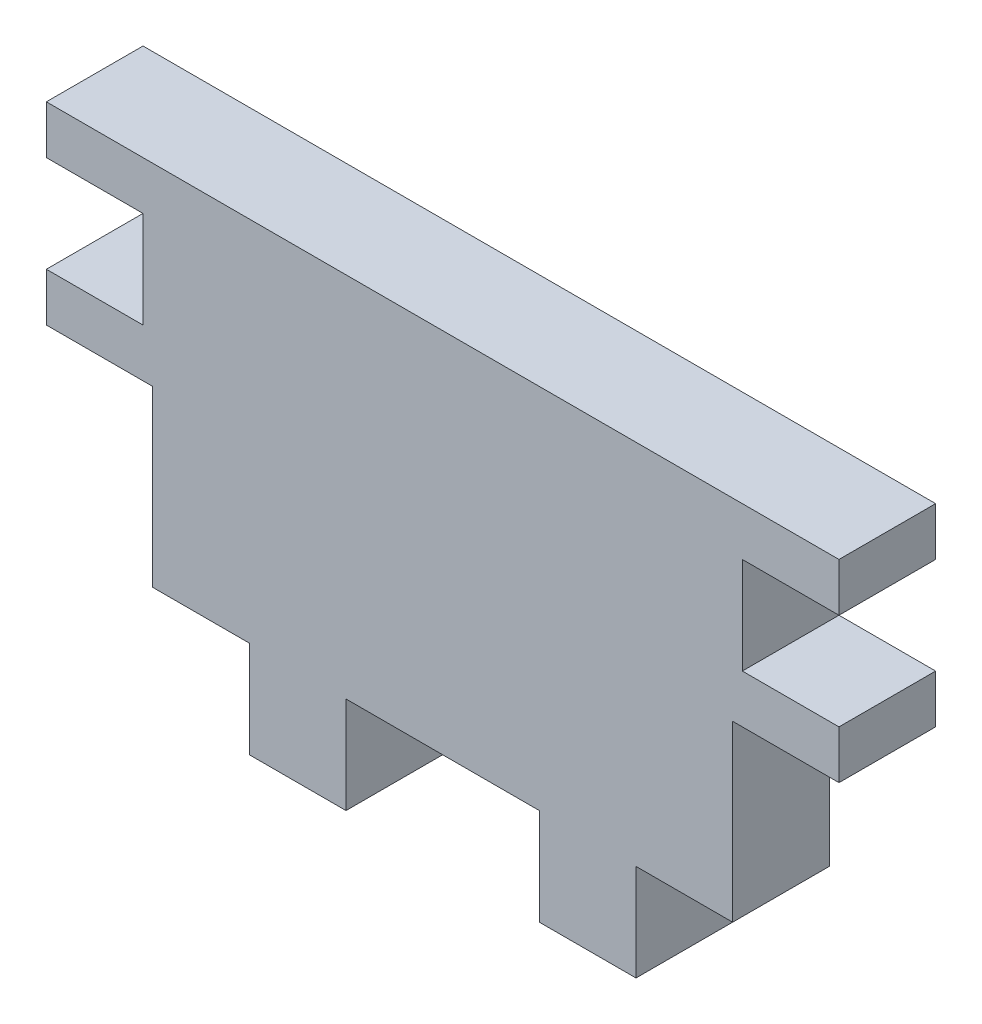
ISO-10303-21;
HEADER;
FILE_DESCRIPTION(('STEP AP214'),'2;1');
FILE_NAME('part.step','',(''),(''),'','','');
FILE_SCHEMA(('AUTOMOTIVE_DESIGN { 1 0 10303 214 1 1 1 1 }'));
ENDSEC;
DATA;
#1=APPLICATION_CONTEXT('core data for automotive mechanical design processes');
#2=APPLICATION_PROTOCOL_DEFINITION('international standard','automotive_design',2000,#1);
#3=PRODUCT_CONTEXT('',#1,'mechanical');
#4=PRODUCT('Part','Part','',(#3));
#5=PRODUCT_RELATED_PRODUCT_CATEGORY('part','',(#4));
#6=PRODUCT_DEFINITION_FORMATION('','',#4);
#7=PRODUCT_DEFINITION_CONTEXT('part definition',#1,'design');
#8=PRODUCT_DEFINITION('design','',#6,#7);
#9=PRODUCT_DEFINITION_SHAPE('','',#8);
#10=(LENGTH_UNIT() NAMED_UNIT(*) SI_UNIT(.MILLI.,.METRE.));
#11=(NAMED_UNIT(*) PLANE_ANGLE_UNIT() SI_UNIT($,.RADIAN.));
#12=(NAMED_UNIT(*) SI_UNIT($,.STERADIAN.) SOLID_ANGLE_UNIT());
#13=UNCERTAINTY_MEASURE_WITH_UNIT(LENGTH_MEASURE(1.E-05),#10,'distance_accuracy_value','');
#14=(GEOMETRIC_REPRESENTATION_CONTEXT(3) GLOBAL_UNCERTAINTY_ASSIGNED_CONTEXT((#13)) GLOBAL_UNIT_ASSIGNED_CONTEXT((#10,
#11,#12)) REPRESENTATION_CONTEXT('',''));
#15=CARTESIAN_POINT('',(0.,0.,0.));
#16=DIRECTION('',(0.,0.,1.));
#17=DIRECTION('',(1.,0.,0.));
#18=AXIS2_PLACEMENT_3D('',#15,#16,#17);
#19=CARTESIAN_POINT('',(0.,24.0190945350207,5.));
#20=DIRECTION('',(0.,-1.,0.));
#21=DIRECTION('',(1.,0.,0.));
#22=AXIS2_PLACEMENT_3D('',#19,#20,#21);
#23=PLANE('',#22);
#24=DIRECTION('',(-1.,0.,0.));
#25=VECTOR('',#24,1.);
#26=CARTESIAN_POINT('',(0.,24.0190945350207,0.));
#27=LINE('',#26,#25);
#28=CARTESIAN_POINT('',(-0.90147055292001,24.0190945350207,0.));
#29=VERTEX_POINT('',#28);
#30=CARTESIAN_POINT('',(-5.90147055292,24.0190945350207,0.));
#31=VERTEX_POINT('',#30);
#32=EDGE_CURVE('E226',#29,#31,#27,.T.);
#33=ORIENTED_EDGE('',*,*,#32,.F.);
#34=DIRECTION('',(0.,0.,-1.));
#35=VECTOR('',#34,1.);
#36=CARTESIAN_POINT('',(-0.90147055292001,24.0190945350207,5.));
#37=LINE('',#36,#35);
#38=CARTESIAN_POINT('',(-0.90147055292001,24.0190945350207,5.));
#39=VERTEX_POINT('',#38);
#40=EDGE_CURVE('E11',#39,#29,#37,.T.);
#41=ORIENTED_EDGE('',*,*,#40,.F.);
#42=DIRECTION('',(-1.,0.,0.));
#43=VECTOR('',#42,1.);
#44=CARTESIAN_POINT('',(0.,24.0190945350207,5.));
#45=LINE('',#44,#43);
#46=CARTESIAN_POINT('',(-5.90147055292,24.0190945350207,5.));
#47=VERTEX_POINT('',#46);
#48=EDGE_CURVE('E286',#39,#47,#45,.T.);
#49=ORIENTED_EDGE('',*,*,#48,.T.);
#50=DIRECTION('',(0.,0.,-1.));
#51=VECTOR('',#50,1.);
#52=CARTESIAN_POINT('',(-5.90147055292,24.0190945350207,5.));
#53=LINE('',#52,#51);
#54=EDGE_CURVE('E50',#47,#31,#53,.T.);
#55=ORIENTED_EDGE('',*,*,#54,.T.);
#56=EDGE_LOOP('',(#33,#41,#49,#55));
#57=FACE_BOUND('',#56,.T.);
#58=ADVANCED_FACE('F34',(#57),#23,.T.);
#59=CARTESIAN_POINT('',(-0.90147055292001,0.,5.));
#60=DIRECTION('',(-1.,0.,0.));
#61=DIRECTION('',(0.,0.,1.));
#62=AXIS2_PLACEMENT_3D('',#59,#60,#61);
#63=PLANE('',#62);
#64=DIRECTION('',(0.,1.,0.));
#65=VECTOR('',#64,1.);
#66=CARTESIAN_POINT('',(-0.90147055292001,0.,0.));
#67=LINE('',#66,#65);
#68=CARTESIAN_POINT('',(-0.90147055292001,26.5190945350207,0.));
#69=VERTEX_POINT('',#68);
#70=EDGE_CURVE('E228',#29,#69,#67,.T.);
#71=ORIENTED_EDGE('',*,*,#70,.T.);
#72=DIRECTION('',(0.,0.,-1.));
#73=VECTOR('',#72,1.);
#74=CARTESIAN_POINT('',(-0.90147055292001,26.5190945350207,5.));
#75=LINE('',#74,#73);
#76=CARTESIAN_POINT('',(-0.90147055292001,26.5190945350207,5.));
#77=VERTEX_POINT('',#76);
#78=EDGE_CURVE('E42',#77,#69,#75,.T.);
#79=ORIENTED_EDGE('',*,*,#78,.F.);
#80=DIRECTION('',(0.,1.,0.));
#81=VECTOR('',#80,1.);
#82=CARTESIAN_POINT('',(-0.90147055292001,0.,5.));
#83=LINE('',#82,#81);
#84=EDGE_CURVE('E354',#39,#77,#83,.T.);
#85=ORIENTED_EDGE('',*,*,#84,.F.);
#86=ORIENTED_EDGE('',*,*,#40,.T.);
#87=EDGE_LOOP('',(#71,#79,#85,#86));
#88=FACE_BOUND('',#87,.T.);
#89=ADVANCED_FACE('F342',(#88),#63,.F.);
#90=CARTESIAN_POINT('',(0.,26.5190945350207,5.));
#91=DIRECTION('',(0.,1.,0.));
#92=DIRECTION('',(-1.,0.,0.));
#93=AXIS2_PLACEMENT_3D('',#90,#91,#92);
#94=PLANE('',#93);
#95=DIRECTION('',(1.,0.,0.));
#96=VECTOR('',#95,1.);
#97=CARTESIAN_POINT('',(0.,26.5190945350207,0.));
#98=LINE('',#97,#96);
#99=CARTESIAN_POINT('',(-41.90147055292,26.5190945350207,0.));
#100=VERTEX_POINT('',#99);
#101=EDGE_CURVE('E231',#100,#69,#98,.T.);
#102=ORIENTED_EDGE('',*,*,#101,.F.);
#103=DIRECTION('',(0.,0.,-1.));
#104=VECTOR('',#103,1.);
#105=CARTESIAN_POINT('',(-41.90147055292,26.5190945350207,5.));
#106=LINE('',#105,#104);
#107=CARTESIAN_POINT('',(-41.90147055292,26.5190945350207,5.));
#108=VERTEX_POINT('',#107);
#109=EDGE_CURVE('E332',#108,#100,#106,.T.);
#110=ORIENTED_EDGE('',*,*,#109,.F.);
#111=DIRECTION('',(1.,0.,0.));
#112=VECTOR('',#111,1.);
#113=CARTESIAN_POINT('',(0.,26.5190945350207,5.));
#114=LINE('',#113,#112);
#115=EDGE_CURVE('E339',#108,#77,#114,.T.);
#116=ORIENTED_EDGE('',*,*,#115,.T.);
#117=ORIENTED_EDGE('',*,*,#78,.T.);
#118=EDGE_LOOP('',(#102,#110,#116,#117));
#119=FACE_BOUND('',#118,.T.);
#120=ADVANCED_FACE('F337',(#119),#94,.T.);
#121=CARTESIAN_POINT('',(-41.90147055292,0.,5.));
#122=DIRECTION('',(-1.,0.,0.));
#123=DIRECTION('',(0.,0.,1.));
#124=AXIS2_PLACEMENT_3D('',#121,#122,#123);
#125=PLANE('',#124);
#126=DIRECTION('',(0.,1.,0.));
#127=VECTOR('',#126,1.);
#128=CARTESIAN_POINT('',(-41.90147055292,0.,0.));
#129=LINE('',#128,#127);
#130=CARTESIAN_POINT('',(-41.90147055292,24.0190945350207,0.));
#131=VERTEX_POINT('',#130);
#132=EDGE_CURVE('E234',#131,#100,#129,.T.);
#133=ORIENTED_EDGE('',*,*,#132,.F.);
#134=DIRECTION('',(0.,0.,-1.));
#135=VECTOR('',#134,1.);
#136=CARTESIAN_POINT('',(-41.90147055292,24.0190945350207,5.));
#137=LINE('',#136,#135);
#138=CARTESIAN_POINT('',(-41.90147055292,24.0190945350207,5.));
#139=VERTEX_POINT('',#138);
#140=EDGE_CURVE('E330',#139,#131,#137,.T.);
#141=ORIENTED_EDGE('',*,*,#140,.F.);
#142=DIRECTION('',(0.,1.,0.));
#143=VECTOR('',#142,1.);
#144=CARTESIAN_POINT('',(-41.90147055292,0.,5.));
#145=LINE('',#144,#143);
#146=EDGE_CURVE('E353',#139,#108,#145,.T.);
#147=ORIENTED_EDGE('',*,*,#146,.T.);
#148=ORIENTED_EDGE('',*,*,#109,.T.);
#149=EDGE_LOOP('',(#133,#141,#147,#148));
#150=FACE_BOUND('',#149,.T.);
#151=ADVANCED_FACE('F349',(#150),#125,.T.);
#152=CARTESIAN_POINT('',(0.,24.0190945350207,5.));
#153=DIRECTION('',(0.,1.,0.));
#154=DIRECTION('',(0.,0.,1.));
#155=AXIS2_PLACEMENT_3D('',#152,#153,#154);
#156=PLANE('',#155);
#157=DIRECTION('',(1.,0.,0.));
#158=VECTOR('',#157,1.);
#159=CARTESIAN_POINT('',(0.,24.0190945350207,0.));
#160=LINE('',#159,#158);
#161=CARTESIAN_POINT('',(-36.90147055292,24.0190945350207,0.));
#162=VERTEX_POINT('',#161);
#163=EDGE_CURVE('E237',#131,#162,#160,.T.);
#164=ORIENTED_EDGE('',*,*,#163,.T.);
#165=DIRECTION('',(0.,0.,-1.));
#166=VECTOR('',#165,1.);
#167=CARTESIAN_POINT('',(-36.90147055292,24.0190945350207,5.));
#168=LINE('',#167,#166);
#169=CARTESIAN_POINT('',(-36.90147055292,24.0190945350207,5.));
#170=VERTEX_POINT('',#169);
#171=EDGE_CURVE('E327',#170,#162,#168,.T.);
#172=ORIENTED_EDGE('',*,*,#171,.F.);
#173=DIRECTION('',(1.,0.,0.));
#174=VECTOR('',#173,1.);
#175=CARTESIAN_POINT('',(0.,24.0190945350207,5.));
#176=LINE('',#175,#174);
#177=EDGE_CURVE('E356',#139,#170,#176,.T.);
#178=ORIENTED_EDGE('',*,*,#177,.F.);
#179=ORIENTED_EDGE('',*,*,#140,.T.);
#180=EDGE_LOOP('',(#164,#172,#178,#179));
#181=FACE_BOUND('',#180,.T.);
#182=ADVANCED_FACE('F425',(#181),#156,.F.);
#183=CARTESIAN_POINT('',(-36.90147055292,0.,5.));
#184=DIRECTION('',(1.,0.,0.));
#185=DIRECTION('',(0.,0.,-1.));
#186=AXIS2_PLACEMENT_3D('',#183,#184,#185);
#187=PLANE('',#186);
#188=DIRECTION('',(0.,-1.,0.));
#189=VECTOR('',#188,1.);
#190=CARTESIAN_POINT('',(-36.90147055292,0.,0.));
#191=LINE('',#190,#189);
#192=CARTESIAN_POINT('',(-36.90147055292,19.0190945350207,0.));
#193=VERTEX_POINT('',#192);
#194=EDGE_CURVE('E239',#162,#193,#191,.T.);
#195=ORIENTED_EDGE('',*,*,#194,.T.);
#196=DIRECTION('',(0.,0.,-1.));
#197=VECTOR('',#196,1.);
#198=CARTESIAN_POINT('',(-36.90147055292,19.0190945350207,5.));
#199=LINE('',#198,#197);
#200=CARTESIAN_POINT('',(-36.90147055292,19.0190945350207,5.));
#201=VERTEX_POINT('',#200);
#202=EDGE_CURVE('E325',#201,#193,#199,.T.);
#203=ORIENTED_EDGE('',*,*,#202,.F.);
#204=DIRECTION('',(0.,-1.,0.));
#205=VECTOR('',#204,1.);
#206=CARTESIAN_POINT('',(-36.90147055292,0.,5.));
#207=LINE('',#206,#205);
#208=EDGE_CURVE('E362',#170,#201,#207,.T.);
#209=ORIENTED_EDGE('',*,*,#208,.F.);
#210=ORIENTED_EDGE('',*,*,#171,.T.);
#211=EDGE_LOOP('',(#195,#203,#209,#210));
#212=FACE_BOUND('',#211,.T.);
#213=ADVANCED_FACE('F428',(#212),#187,.F.);
#214=CARTESIAN_POINT('',(0.,19.0190945350207,5.));
#215=DIRECTION('',(0.,1.,0.));
#216=DIRECTION('',(0.,0.,1.));
#217=AXIS2_PLACEMENT_3D('',#214,#215,#216);
#218=PLANE('',#217);
#219=DIRECTION('',(1.,0.,0.));
#220=VECTOR('',#219,1.);
#221=CARTESIAN_POINT('',(0.,19.0190945350207,0.));
#222=LINE('',#221,#220);
#223=CARTESIAN_POINT('',(-41.90147055292,19.0190945350207,0.));
#224=VERTEX_POINT('',#223);
#225=EDGE_CURVE('E242',#224,#193,#222,.T.);
#226=ORIENTED_EDGE('',*,*,#225,.F.);
#227=DIRECTION('',(0.,0.,-1.));
#228=VECTOR('',#227,1.);
#229=CARTESIAN_POINT('',(-41.90147055292,19.0190945350207,5.));
#230=LINE('',#229,#228);
#231=CARTESIAN_POINT('',(-41.90147055292,19.0190945350207,5.));
#232=VERTEX_POINT('',#231);
#233=EDGE_CURVE('E323',#232,#224,#230,.T.);
#234=ORIENTED_EDGE('',*,*,#233,.F.);
#235=DIRECTION('',(1.,0.,0.));
#236=VECTOR('',#235,1.);
#237=CARTESIAN_POINT('',(0.,19.0190945350207,5.));
#238=LINE('',#237,#236);
#239=EDGE_CURVE('E364',#232,#201,#238,.T.);
#240=ORIENTED_EDGE('',*,*,#239,.T.);
#241=ORIENTED_EDGE('',*,*,#202,.T.);
#242=EDGE_LOOP('',(#226,#234,#240,#241));
#243=FACE_BOUND('',#242,.T.);
#244=ADVANCED_FACE('F432',(#243),#218,.T.);
#245=CARTESIAN_POINT('',(-41.90147055292,0.,5.));
#246=DIRECTION('',(1.,0.,0.));
#247=DIRECTION('',(0.,0.,-1.));
#248=AXIS2_PLACEMENT_3D('',#245,#246,#247);
#249=PLANE('',#248);
#250=DIRECTION('',(0.,-1.,0.));
#251=VECTOR('',#250,1.);
#252=CARTESIAN_POINT('',(-41.90147055292,0.,0.));
#253=LINE('',#252,#251);
#254=CARTESIAN_POINT('',(-41.90147055292,16.5190945350207,0.));
#255=VERTEX_POINT('',#254);
#256=EDGE_CURVE('E245',#224,#255,#253,.T.);
#257=ORIENTED_EDGE('',*,*,#256,.T.);
#258=DIRECTION('',(0.,0.,-1.));
#259=VECTOR('',#258,1.);
#260=CARTESIAN_POINT('',(-41.90147055292,16.5190945350207,5.));
#261=LINE('',#260,#259);
#262=CARTESIAN_POINT('',(-41.90147055292,16.5190945350207,5.));
#263=VERTEX_POINT('',#262);
#264=EDGE_CURVE('E320',#263,#255,#261,.T.);
#265=ORIENTED_EDGE('',*,*,#264,.F.);
#266=DIRECTION('',(0.,-1.,0.));
#267=VECTOR('',#266,1.);
#268=CARTESIAN_POINT('',(-41.90147055292,0.,5.));
#269=LINE('',#268,#267);
#270=EDGE_CURVE('E367',#232,#263,#269,.T.);
#271=ORIENTED_EDGE('',*,*,#270,.F.);
#272=ORIENTED_EDGE('',*,*,#233,.T.);
#273=EDGE_LOOP('',(#257,#265,#271,#272));
#274=FACE_BOUND('',#273,.T.);
#275=ADVANCED_FACE('F436',(#274),#249,.F.);
#276=CARTESIAN_POINT('',(0.,16.5190945350207,5.));
#277=DIRECTION('',(0.,1.,0.));
#278=DIRECTION('',(0.,0.,1.));
#279=AXIS2_PLACEMENT_3D('',#276,#277,#278);
#280=PLANE('',#279);
#281=DIRECTION('',(1.,0.,0.));
#282=VECTOR('',#281,1.);
#283=CARTESIAN_POINT('',(0.,16.5190945350207,0.));
#284=LINE('',#283,#282);
#285=CARTESIAN_POINT('',(-36.40147055292,16.5190945350207,0.));
#286=VERTEX_POINT('',#285);
#287=EDGE_CURVE('E247',#255,#286,#284,.T.);
#288=ORIENTED_EDGE('',*,*,#287,.T.);
#289=DIRECTION('',(0.,0.,-1.));
#290=VECTOR('',#289,1.);
#291=CARTESIAN_POINT('',(-36.40147055292,16.5190945350207,5.));
#292=LINE('',#291,#290);
#293=CARTESIAN_POINT('',(-36.40147055292,16.5190945350207,5.));
#294=VERTEX_POINT('',#293);
#295=EDGE_CURVE('E317',#294,#286,#292,.T.);
#296=ORIENTED_EDGE('',*,*,#295,.F.);
#297=DIRECTION('',(1.,0.,0.));
#298=VECTOR('',#297,1.);
#299=CARTESIAN_POINT('',(0.,16.5190945350207,5.));
#300=LINE('',#299,#298);
#301=EDGE_CURVE('E369',#263,#294,#300,.T.);
#302=ORIENTED_EDGE('',*,*,#301,.F.);
#303=ORIENTED_EDGE('',*,*,#264,.T.);
#304=EDGE_LOOP('',(#288,#296,#302,#303));
#305=FACE_BOUND('',#304,.T.);
#306=ADVANCED_FACE('F440',(#305),#280,.F.);
#307=CARTESIAN_POINT('',(-36.40147055292,0.,5.));
#308=DIRECTION('',(1.,0.,0.));
#309=DIRECTION('',(0.,0.,-1.));
#310=AXIS2_PLACEMENT_3D('',#307,#308,#309);
#311=PLANE('',#310);
#312=DIRECTION('',(0.,-1.,0.));
#313=VECTOR('',#312,1.);
#314=CARTESIAN_POINT('',(-36.40147055292,0.,0.));
#315=LINE('',#314,#313);
#316=CARTESIAN_POINT('',(-36.40147055292,7.51909453502073,0.));
#317=VERTEX_POINT('',#316);
#318=EDGE_CURVE('E249',#286,#317,#315,.T.);
#319=ORIENTED_EDGE('',*,*,#318,.T.);
#320=DIRECTION('',(0.,0.,-1.));
#321=VECTOR('',#320,1.);
#322=CARTESIAN_POINT('',(-36.40147055292,7.51909453502073,5.));
#323=LINE('',#322,#321);
#324=CARTESIAN_POINT('',(-36.40147055292,7.51909453502073,5.));
#325=VERTEX_POINT('',#324);
#326=EDGE_CURVE('E314',#325,#317,#323,.T.);
#327=ORIENTED_EDGE('',*,*,#326,.F.);
#328=DIRECTION('',(0.,-1.,0.));
#329=VECTOR('',#328,1.);
#330=CARTESIAN_POINT('',(-36.40147055292,0.,5.));
#331=LINE('',#330,#329);
#332=EDGE_CURVE('E371',#294,#325,#331,.T.);
#333=ORIENTED_EDGE('',*,*,#332,.F.);
#334=ORIENTED_EDGE('',*,*,#295,.T.);
#335=EDGE_LOOP('',(#319,#327,#333,#334));
#336=FACE_BOUND('',#335,.T.);
#337=ADVANCED_FACE('F444',(#336),#311,.F.);
#338=CARTESIAN_POINT('',(0.,7.51909453502073,5.));
#339=DIRECTION('',(0.,1.,0.));
#340=DIRECTION('',(0.,0.,1.));
#341=AXIS2_PLACEMENT_3D('',#338,#339,#340);
#342=PLANE('',#341);
#343=DIRECTION('',(1.,0.,0.));
#344=VECTOR('',#343,1.);
#345=CARTESIAN_POINT('',(0.,7.51909453502073,0.));
#346=LINE('',#345,#344);
#347=CARTESIAN_POINT('',(-31.40147055292,7.51909453502073,0.));
#348=VERTEX_POINT('',#347);
#349=EDGE_CURVE('E251',#317,#348,#346,.T.);
#350=ORIENTED_EDGE('',*,*,#349,.T.);
#351=DIRECTION('',(0.,0.,-1.));
#352=VECTOR('',#351,1.);
#353=CARTESIAN_POINT('',(-31.40147055292,7.51909453502073,5.));
#354=LINE('',#353,#352);
#355=CARTESIAN_POINT('',(-31.40147055292,7.51909453502073,5.));
#356=VERTEX_POINT('',#355);
#357=EDGE_CURVE('E311',#356,#348,#354,.T.);
#358=ORIENTED_EDGE('',*,*,#357,.F.);
#359=DIRECTION('',(1.,0.,0.));
#360=VECTOR('',#359,1.);
#361=CARTESIAN_POINT('',(0.,7.51909453502073,5.));
#362=LINE('',#361,#360);
#363=EDGE_CURVE('E373',#325,#356,#362,.T.);
#364=ORIENTED_EDGE('',*,*,#363,.F.);
#365=ORIENTED_EDGE('',*,*,#326,.T.);
#366=EDGE_LOOP('',(#350,#358,#364,#365));
#367=FACE_BOUND('',#366,.T.);
#368=ADVANCED_FACE('F448',(#367),#342,.F.);
#369=CARTESIAN_POINT('',(-31.40147055292,0.,5.));
#370=DIRECTION('',(1.,0.,0.));
#371=DIRECTION('',(0.,0.,-1.));
#372=AXIS2_PLACEMENT_3D('',#369,#370,#371);
#373=PLANE('',#372);
#374=DIRECTION('',(0.,-1.,0.));
#375=VECTOR('',#374,1.);
#376=CARTESIAN_POINT('',(-31.40147055292,0.,0.));
#377=LINE('',#376,#375);
#378=CARTESIAN_POINT('',(-31.40147055292,2.51909453502073,0.));
#379=VERTEX_POINT('',#378);
#380=EDGE_CURVE('E253',#348,#379,#377,.T.);
#381=ORIENTED_EDGE('',*,*,#380,.T.);
#382=DIRECTION('',(0.,0.,-1.));
#383=VECTOR('',#382,1.);
#384=CARTESIAN_POINT('',(-31.40147055292,2.51909453502073,5.));
#385=LINE('',#384,#383);
#386=CARTESIAN_POINT('',(-31.40147055292,2.51909453502073,5.));
#387=VERTEX_POINT('',#386);
#388=EDGE_CURVE('E308',#387,#379,#385,.T.);
#389=ORIENTED_EDGE('',*,*,#388,.F.);
#390=DIRECTION('',(0.,-1.,0.));
#391=VECTOR('',#390,1.);
#392=CARTESIAN_POINT('',(-31.40147055292,0.,5.));
#393=LINE('',#392,#391);
#394=EDGE_CURVE('E375',#356,#387,#393,.T.);
#395=ORIENTED_EDGE('',*,*,#394,.F.);
#396=ORIENTED_EDGE('',*,*,#357,.T.);
#397=EDGE_LOOP('',(#381,#389,#395,#396));
#398=FACE_BOUND('',#397,.T.);
#399=ADVANCED_FACE('F452',(#398),#373,.F.);
#400=CARTESIAN_POINT('',(0.,2.51909453502073,5.));
#401=DIRECTION('',(0.,1.,0.));
#402=DIRECTION('',(0.,0.,1.));
#403=AXIS2_PLACEMENT_3D('',#400,#401,#402);
#404=PLANE('',#403);
#405=DIRECTION('',(1.,0.,0.));
#406=VECTOR('',#405,1.);
#407=CARTESIAN_POINT('',(0.,2.51909453502073,0.));
#408=LINE('',#407,#406);
#409=CARTESIAN_POINT('',(-26.40147055292,2.51909453502073,0.));
#410=VERTEX_POINT('',#409);
#411=EDGE_CURVE('E255',#379,#410,#408,.T.);
#412=ORIENTED_EDGE('',*,*,#411,.T.);
#413=DIRECTION('',(0.,0.,-1.));
#414=VECTOR('',#413,1.);
#415=CARTESIAN_POINT('',(-26.40147055292,2.51909453502073,5.));
#416=LINE('',#415,#414);
#417=CARTESIAN_POINT('',(-26.40147055292,2.51909453502073,5.));
#418=VERTEX_POINT('',#417);
#419=EDGE_CURVE('E305',#418,#410,#416,.T.);
#420=ORIENTED_EDGE('',*,*,#419,.F.);
#421=DIRECTION('',(1.,0.,0.));
#422=VECTOR('',#421,1.);
#423=CARTESIAN_POINT('',(0.,2.51909453502073,5.));
#424=LINE('',#423,#422);
#425=EDGE_CURVE('E377',#387,#418,#424,.T.);
#426=ORIENTED_EDGE('',*,*,#425,.F.);
#427=ORIENTED_EDGE('',*,*,#388,.T.);
#428=EDGE_LOOP('',(#412,#420,#426,#427));
#429=FACE_BOUND('',#428,.T.);
#430=ADVANCED_FACE('F456',(#429),#404,.F.);
#431=CARTESIAN_POINT('',(-26.40147055292,0.,5.));
#432=DIRECTION('',(-1.,0.,0.));
#433=DIRECTION('',(0.,0.,1.));
#434=AXIS2_PLACEMENT_3D('',#431,#432,#433);
#435=PLANE('',#434);
#436=DIRECTION('',(0.,1.,0.));
#437=VECTOR('',#436,1.);
#438=CARTESIAN_POINT('',(-26.40147055292,0.,0.));
#439=LINE('',#438,#437);
#440=CARTESIAN_POINT('',(-26.40147055292,7.51909453502073,0.));
#441=VERTEX_POINT('',#440);
#442=EDGE_CURVE('E257',#410,#441,#439,.T.);
#443=ORIENTED_EDGE('',*,*,#442,.T.);
#444=DIRECTION('',(0.,0.,-1.));
#445=VECTOR('',#444,1.);
#446=CARTESIAN_POINT('',(-26.40147055292,7.51909453502073,5.));
#447=LINE('',#446,#445);
#448=CARTESIAN_POINT('',(-26.40147055292,7.51909453502073,5.));
#449=VERTEX_POINT('',#448);
#450=EDGE_CURVE('E302',#449,#441,#447,.T.);
#451=ORIENTED_EDGE('',*,*,#450,.F.);
#452=DIRECTION('',(0.,1.,0.));
#453=VECTOR('',#452,1.);
#454=CARTESIAN_POINT('',(-26.40147055292,0.,5.));
#455=LINE('',#454,#453);
#456=EDGE_CURVE('E379',#418,#449,#455,.T.);
#457=ORIENTED_EDGE('',*,*,#456,.F.);
#458=ORIENTED_EDGE('',*,*,#419,.T.);
#459=EDGE_LOOP('',(#443,#451,#457,#458));
#460=FACE_BOUND('',#459,.T.);
#461=ADVANCED_FACE('F460',(#460),#435,.F.);
#462=CARTESIAN_POINT('',(0.,7.51909453502075,5.));
#463=DIRECTION('',(0.,1.,0.));
#464=DIRECTION('',(-1.,0.,0.));
#465=AXIS2_PLACEMENT_3D('',#462,#463,#464);
#466=PLANE('',#465);
#467=DIRECTION('',(1.,0.,0.));
#468=VECTOR('',#467,1.);
#469=CARTESIAN_POINT('',(0.,7.51909453502075,0.));
#470=LINE('',#469,#468);
#471=CARTESIAN_POINT('',(-16.40147055292,7.51909453502074,0.));
#472=VERTEX_POINT('',#471);
#473=EDGE_CURVE('E259',#441,#472,#470,.T.);
#474=ORIENTED_EDGE('',*,*,#473,.T.);
#475=DIRECTION('',(0.,0.,-1.));
#476=VECTOR('',#475,1.);
#477=CARTESIAN_POINT('',(-16.40147055292,7.51909453502074,5.));
#478=LINE('',#477,#476);
#479=CARTESIAN_POINT('',(-16.40147055292,7.51909453502074,5.));
#480=VERTEX_POINT('',#479);
#481=EDGE_CURVE('E300',#480,#472,#478,.T.);
#482=ORIENTED_EDGE('',*,*,#481,.F.);
#483=DIRECTION('',(1.,0.,0.));
#484=VECTOR('',#483,1.);
#485=CARTESIAN_POINT('',(0.,7.51909453502075,5.));
#486=LINE('',#485,#484);
#487=EDGE_CURVE('E381',#449,#480,#486,.T.);
#488=ORIENTED_EDGE('',*,*,#487,.F.);
#489=ORIENTED_EDGE('',*,*,#450,.T.);
#490=EDGE_LOOP('',(#474,#482,#488,#489));
#491=FACE_BOUND('',#490,.T.);
#492=ADVANCED_FACE('F464',(#491),#466,.F.);
#493=CARTESIAN_POINT('',(-16.40147055292,0.,5.));
#494=DIRECTION('',(-1.,0.,0.));
#495=DIRECTION('',(0.,-1.,0.));
#496=AXIS2_PLACEMENT_3D('',#493,#494,#495);
#497=PLANE('',#496);
#498=DIRECTION('',(0.,1.,0.));
#499=VECTOR('',#498,1.);
#500=CARTESIAN_POINT('',(-16.40147055292,0.,0.));
#501=LINE('',#500,#499);
#502=CARTESIAN_POINT('',(-16.40147055292,2.51909453502074,0.));
#503=VERTEX_POINT('',#502);
#504=EDGE_CURVE('E262',#503,#472,#501,.T.);
#505=ORIENTED_EDGE('',*,*,#504,.F.);
#506=DIRECTION('',(0.,0.,-1.));
#507=VECTOR('',#506,1.);
#508=CARTESIAN_POINT('',(-16.40147055292,2.51909453502074,5.));
#509=LINE('',#508,#507);
#510=CARTESIAN_POINT('',(-16.40147055292,2.51909453502074,5.));
#511=VERTEX_POINT('',#510);
#512=EDGE_CURVE('E298',#511,#503,#509,.T.);
#513=ORIENTED_EDGE('',*,*,#512,.F.);
#514=DIRECTION('',(0.,1.,0.));
#515=VECTOR('',#514,1.);
#516=CARTESIAN_POINT('',(-16.40147055292,0.,5.));
#517=LINE('',#516,#515);
#518=EDGE_CURVE('E383',#511,#480,#517,.T.);
#519=ORIENTED_EDGE('',*,*,#518,.T.);
#520=ORIENTED_EDGE('',*,*,#481,.T.);
#521=EDGE_LOOP('',(#505,#513,#519,#520));
#522=FACE_BOUND('',#521,.T.);
#523=ADVANCED_FACE('F468',(#522),#497,.T.);
#524=CARTESIAN_POINT('',(0.,2.51909453502074,5.));
#525=DIRECTION('',(0.,-1.,0.));
#526=DIRECTION('',(0.,0.,-1.));
#527=AXIS2_PLACEMENT_3D('',#524,#525,#526);
#528=PLANE('',#527);
#529=DIRECTION('',(-1.,0.,0.));
#530=VECTOR('',#529,1.);
#531=CARTESIAN_POINT('',(0.,2.51909453502074,0.));
#532=LINE('',#531,#530);
#533=CARTESIAN_POINT('',(-11.40147055292,2.51909453502074,0.));
#534=VERTEX_POINT('',#533);
#535=EDGE_CURVE('E265',#534,#503,#532,.T.);
#536=ORIENTED_EDGE('',*,*,#535,.F.);
#537=DIRECTION('',(0.,0.,-1.));
#538=VECTOR('',#537,1.);
#539=CARTESIAN_POINT('',(-11.40147055292,2.51909453502074,5.));
#540=LINE('',#539,#538);
#541=CARTESIAN_POINT('',(-11.40147055292,2.51909453502074,5.));
#542=VERTEX_POINT('',#541);
#543=EDGE_CURVE('E296',#542,#534,#540,.T.);
#544=ORIENTED_EDGE('',*,*,#543,.F.);
#545=DIRECTION('',(-1.,0.,0.));
#546=VECTOR('',#545,1.);
#547=CARTESIAN_POINT('',(0.,2.51909453502074,5.));
#548=LINE('',#547,#546);
#549=EDGE_CURVE('E386',#542,#511,#548,.T.);
#550=ORIENTED_EDGE('',*,*,#549,.T.);
#551=ORIENTED_EDGE('',*,*,#512,.T.);
#552=EDGE_LOOP('',(#536,#544,#550,#551));
#553=FACE_BOUND('',#552,.T.);
#554=ADVANCED_FACE('F472',(#553),#528,.T.);
#555=CARTESIAN_POINT('',(-11.40147055292,0.,5.));
#556=DIRECTION('',(1.,0.,0.));
#557=DIRECTION('',(0.,1.,0.));
#558=AXIS2_PLACEMENT_3D('',#555,#556,#557);
#559=PLANE('',#558);
#560=DIRECTION('',(0.,-1.,0.));
#561=VECTOR('',#560,1.);
#562=CARTESIAN_POINT('',(-11.40147055292,0.,0.));
#563=LINE('',#562,#561);
#564=CARTESIAN_POINT('',(-11.40147055292,7.51909453502074,0.));
#565=VERTEX_POINT('',#564);
#566=EDGE_CURVE('E268',#565,#534,#563,.T.);
#567=ORIENTED_EDGE('',*,*,#566,.F.);
#568=DIRECTION('',(0.,0.,-1.));
#569=VECTOR('',#568,1.);
#570=CARTESIAN_POINT('',(-11.40147055292,7.51909453502074,5.));
#571=LINE('',#570,#569);
#572=CARTESIAN_POINT('',(-11.40147055292,7.51909453502074,5.));
#573=VERTEX_POINT('',#572);
#574=EDGE_CURVE('E294',#573,#565,#571,.T.);
#575=ORIENTED_EDGE('',*,*,#574,.F.);
#576=DIRECTION('',(0.,-1.,0.));
#577=VECTOR('',#576,1.);
#578=CARTESIAN_POINT('',(-11.40147055292,0.,5.));
#579=LINE('',#578,#577);
#580=EDGE_CURVE('E389',#573,#542,#579,.T.);
#581=ORIENTED_EDGE('',*,*,#580,.T.);
#582=ORIENTED_EDGE('',*,*,#543,.T.);
#583=EDGE_LOOP('',(#567,#575,#581,#582));
#584=FACE_BOUND('',#583,.T.);
#585=ADVANCED_FACE('F476',(#584),#559,.T.);
#586=CARTESIAN_POINT('',(0.,7.51909453502076,5.));
#587=DIRECTION('',(0.,-1.,0.));
#588=DIRECTION('',(1.,0.,0.));
#589=AXIS2_PLACEMENT_3D('',#586,#587,#588);
#590=PLANE('',#589);
#591=DIRECTION('',(-1.,0.,0.));
#592=VECTOR('',#591,1.);
#593=CARTESIAN_POINT('',(0.,7.51909453502076,0.));
#594=LINE('',#593,#592);
#595=CARTESIAN_POINT('',(-6.40147055291999,7.51909453502075,0.));
#596=VERTEX_POINT('',#595);
#597=EDGE_CURVE('E271',#596,#565,#594,.T.);
#598=ORIENTED_EDGE('',*,*,#597,.F.);
#599=DIRECTION('',(0.,0.,-1.));
#600=VECTOR('',#599,1.);
#601=CARTESIAN_POINT('',(-6.40147055291999,7.51909453502075,5.));
#602=LINE('',#601,#600);
#603=CARTESIAN_POINT('',(-6.40147055291999,7.51909453502075,5.));
#604=VERTEX_POINT('',#603);
#605=EDGE_CURVE('E292',#604,#596,#602,.T.);
#606=ORIENTED_EDGE('',*,*,#605,.F.);
#607=DIRECTION('',(-1.,0.,0.));
#608=VECTOR('',#607,1.);
#609=CARTESIAN_POINT('',(0.,7.51909453502076,5.));
#610=LINE('',#609,#608);
#611=EDGE_CURVE('E392',#604,#573,#610,.T.);
#612=ORIENTED_EDGE('',*,*,#611,.T.);
#613=ORIENTED_EDGE('',*,*,#574,.T.);
#614=EDGE_LOOP('',(#598,#606,#612,#613));
#615=FACE_BOUND('',#614,.T.);
#616=ADVANCED_FACE('F480',(#615),#590,.T.);
#617=CARTESIAN_POINT('',(-6.40147055291999,0.,5.));
#618=DIRECTION('',(1.,0.,0.));
#619=DIRECTION('',(0.,1.,0.));
#620=AXIS2_PLACEMENT_3D('',#617,#618,#619);
#621=PLANE('',#620);
#622=DIRECTION('',(0.,-1.,0.));
#623=VECTOR('',#622,1.);
#624=CARTESIAN_POINT('',(-6.40147055291999,0.,0.));
#625=LINE('',#624,#623);
#626=CARTESIAN_POINT('',(-6.40147055292,16.5190945350207,0.));
#627=VERTEX_POINT('',#626);
#628=EDGE_CURVE('E274',#627,#596,#625,.T.);
#629=ORIENTED_EDGE('',*,*,#628,.F.);
#630=DIRECTION('',(0.,0.,-1.));
#631=VECTOR('',#630,1.);
#632=CARTESIAN_POINT('',(-6.40147055292,16.5190945350207,5.));
#633=LINE('',#632,#631);
#634=CARTESIAN_POINT('',(-6.40147055292,16.5190945350207,5.));
#635=VERTEX_POINT('',#634);
#636=EDGE_CURVE('E290',#635,#627,#633,.T.);
#637=ORIENTED_EDGE('',*,*,#636,.F.);
#638=DIRECTION('',(0.,-1.,0.));
#639=VECTOR('',#638,1.);
#640=CARTESIAN_POINT('',(-6.40147055291999,0.,5.));
#641=LINE('',#640,#639);
#642=EDGE_CURVE('E221',#635,#604,#641,.T.);
#643=ORIENTED_EDGE('',*,*,#642,.T.);
#644=ORIENTED_EDGE('',*,*,#605,.T.);
#645=EDGE_LOOP('',(#629,#637,#643,#644));
#646=FACE_BOUND('',#645,.T.);
#647=ADVANCED_FACE('F397',(#646),#621,.T.);
#648=CARTESIAN_POINT('',(0.,16.5190945350208,5.));
#649=DIRECTION('',(0.,-1.,0.));
#650=DIRECTION('',(1.,0.,0.));
#651=AXIS2_PLACEMENT_3D('',#648,#649,#650);
#652=PLANE('',#651);
#653=DIRECTION('',(-1.,0.,0.));
#654=VECTOR('',#653,1.);
#655=CARTESIAN_POINT('',(0.,16.5190945350208,0.));
#656=LINE('',#655,#654);
#657=CARTESIAN_POINT('',(-0.901470552920003,16.5190945350208,0.));
#658=VERTEX_POINT('',#657);
#659=EDGE_CURVE('E277',#658,#627,#656,.T.);
#660=ORIENTED_EDGE('',*,*,#659,.F.);
#661=DIRECTION('',(0.,0.,-1.));
#662=VECTOR('',#661,1.);
#663=CARTESIAN_POINT('',(-0.901470552920003,16.5190945350208,5.));
#664=LINE('',#663,#662);
#665=CARTESIAN_POINT('',(-0.901470552920003,16.5190945350208,5.));
#666=VERTEX_POINT('',#665);
#667=EDGE_CURVE('E206',#666,#658,#664,.T.);
#668=ORIENTED_EDGE('',*,*,#667,.F.);
#669=DIRECTION('',(-1.,0.,0.));
#670=VECTOR('',#669,1.);
#671=CARTESIAN_POINT('',(0.,16.5190945350208,5.));
#672=LINE('',#671,#670);
#673=EDGE_CURVE('E219',#666,#635,#672,.T.);
#674=ORIENTED_EDGE('',*,*,#673,.T.);
#675=ORIENTED_EDGE('',*,*,#636,.T.);
#676=EDGE_LOOP('',(#660,#668,#674,#675));
#677=FACE_BOUND('',#676,.T.);
#678=ADVANCED_FACE('F403',(#677),#652,.T.);
#679=CARTESIAN_POINT('',(-0.901470552920003,0.,5.));
#680=DIRECTION('',(1.,0.,0.));
#681=DIRECTION('',(0.,0.,-1.));
#682=AXIS2_PLACEMENT_3D('',#679,#680,#681);
#683=PLANE('',#682);
#684=DIRECTION('',(0.,-1.,0.));
#685=VECTOR('',#684,1.);
#686=CARTESIAN_POINT('',(-0.901470552920003,0.,0.));
#687=LINE('',#686,#685);
#688=CARTESIAN_POINT('',(-0.901470552920003,19.0190945350207,0.));
#689=VERTEX_POINT('',#688);
#690=EDGE_CURVE('E203',#689,#658,#687,.T.);
#691=ORIENTED_EDGE('',*,*,#690,.F.);
#692=DIRECTION('',(0.,0.,-1.));
#693=VECTOR('',#692,1.);
#694=CARTESIAN_POINT('',(-0.901470552920003,19.0190945350207,5.));
#695=LINE('',#694,#693);
#696=CARTESIAN_POINT('',(-0.901470552920003,19.0190945350207,5.));
#697=VERTEX_POINT('',#696);
#698=EDGE_CURVE('E197',#697,#689,#695,.T.);
#699=ORIENTED_EDGE('',*,*,#698,.F.);
#700=DIRECTION('',(0.,-1.,0.));
#701=VECTOR('',#700,1.);
#702=CARTESIAN_POINT('',(-0.901470552920003,0.,5.));
#703=LINE('',#702,#701);
#704=EDGE_CURVE('E201',#697,#666,#703,.T.);
#705=ORIENTED_EDGE('',*,*,#704,.T.);
#706=ORIENTED_EDGE('',*,*,#667,.T.);
#707=EDGE_LOOP('',(#691,#699,#705,#706));
#708=FACE_BOUND('',#707,.T.);
#709=ADVANCED_FACE('F199',(#708),#683,.T.);
#710=CARTESIAN_POINT('',(0.,19.0190945350207,5.));
#711=DIRECTION('',(0.,-1.,0.));
#712=DIRECTION('',(0.,0.,-1.));
#713=AXIS2_PLACEMENT_3D('',#710,#711,#712);
#714=PLANE('',#713);
#715=DIRECTION('',(-1.,0.,0.));
#716=VECTOR('',#715,1.);
#717=CARTESIAN_POINT('',(0.,19.0190945350207,0.));
#718=LINE('',#717,#716);
#719=CARTESIAN_POINT('',(-5.90147055292,19.0190945350207,0.));
#720=VERTEX_POINT('',#719);
#721=EDGE_CURVE('E281',#689,#720,#718,.T.);
#722=ORIENTED_EDGE('',*,*,#721,.T.);
#723=DIRECTION('',(0.,0.,-1.));
#724=VECTOR('',#723,1.);
#725=CARTESIAN_POINT('',(-5.90147055292,19.0190945350207,5.));
#726=LINE('',#725,#724);
#727=CARTESIAN_POINT('',(-5.90147055292,19.0190945350207,5.));
#728=VERTEX_POINT('',#727);
#729=EDGE_CURVE('E124',#728,#720,#726,.T.);
#730=ORIENTED_EDGE('',*,*,#729,.F.);
#731=DIRECTION('',(-1.,0.,0.));
#732=VECTOR('',#731,1.);
#733=CARTESIAN_POINT('',(0.,19.0190945350207,5.));
#734=LINE('',#733,#732);
#735=EDGE_CURVE('E208',#697,#728,#734,.T.);
#736=ORIENTED_EDGE('',*,*,#735,.F.);
#737=ORIENTED_EDGE('',*,*,#698,.T.);
#738=EDGE_LOOP('',(#722,#730,#736,#737));
#739=FACE_BOUND('',#738,.T.);
#740=ADVANCED_FACE('F209',(#739),#714,.F.);
#741=CARTESIAN_POINT('',(-5.90147055291999,0.,5.));
#742=DIRECTION('',(1.,0.,0.));
#743=DIRECTION('',(0.,1.,0.));
#744=AXIS2_PLACEMENT_3D('',#741,#742,#743);
#745=PLANE('',#744);
#746=DIRECTION('',(0.,-1.,0.));
#747=VECTOR('',#746,1.);
#748=CARTESIAN_POINT('',(-5.90147055291999,0.,0.));
#749=LINE('',#748,#747);
#750=EDGE_CURVE('E283',#31,#720,#749,.T.);
#751=ORIENTED_EDGE('',*,*,#750,.F.);
#752=ORIENTED_EDGE('',*,*,#54,.F.);
#753=DIRECTION('',(0.,-1.,0.));
#754=VECTOR('',#753,1.);
#755=CARTESIAN_POINT('',(-5.90147055291999,0.,5.));
#756=LINE('',#755,#754);
#757=EDGE_CURVE('E212',#47,#728,#756,.T.);
#758=ORIENTED_EDGE('',*,*,#757,.T.);
#759=ORIENTED_EDGE('',*,*,#729,.T.);
#760=EDGE_LOOP('',(#751,#752,#758,#759));
#761=FACE_BOUND('',#760,.T.);
#762=ADVANCED_FACE('F404',(#761),#745,.T.);
#763=CARTESIAN_POINT('',(0.,0.,5.));
#764=DIRECTION('',(0.,0.,1.));
#765=DIRECTION('',(1.,0.,0.));
#766=AXIS2_PLACEMENT_3D('',#763,#764,#765);
#767=PLANE('',#766);
#768=ORIENTED_EDGE('',*,*,#48,.F.);
#769=ORIENTED_EDGE('',*,*,#84,.T.);
#770=ORIENTED_EDGE('',*,*,#115,.F.);
#771=ORIENTED_EDGE('',*,*,#146,.F.);
#772=ORIENTED_EDGE('',*,*,#177,.T.);
#773=ORIENTED_EDGE('',*,*,#208,.T.);
#774=ORIENTED_EDGE('',*,*,#239,.F.);
#775=ORIENTED_EDGE('',*,*,#270,.T.);
#776=ORIENTED_EDGE('',*,*,#301,.T.);
#777=ORIENTED_EDGE('',*,*,#332,.T.);
#778=ORIENTED_EDGE('',*,*,#363,.T.);
#779=ORIENTED_EDGE('',*,*,#394,.T.);
#780=ORIENTED_EDGE('',*,*,#425,.T.);
#781=ORIENTED_EDGE('',*,*,#456,.T.);
#782=ORIENTED_EDGE('',*,*,#487,.T.);
#783=ORIENTED_EDGE('',*,*,#518,.F.);
#784=ORIENTED_EDGE('',*,*,#549,.F.);
#785=ORIENTED_EDGE('',*,*,#580,.F.);
#786=ORIENTED_EDGE('',*,*,#611,.F.);
#787=ORIENTED_EDGE('',*,*,#642,.F.);
#788=ORIENTED_EDGE('',*,*,#673,.F.);
#789=ORIENTED_EDGE('',*,*,#704,.F.);
#790=ORIENTED_EDGE('',*,*,#735,.T.);
#791=ORIENTED_EDGE('',*,*,#757,.F.);
#792=EDGE_LOOP('',(#768,#769,#770,#771,#772,#773,#774,#775,#776,#777,#778,#779,#780,#781,#782,
#783,#784,#785,#786,#787,#788,#789,#790,#791));
#793=FACE_BOUND('',#792,.T.);
#794=ADVANCED_FACE('F216',(#793),#767,.T.);
#795=CARTESIAN_POINT('',(0.,0.,0.));
#796=DIRECTION('',(0.,0.,1.));
#797=DIRECTION('',(1.,0.,0.));
#798=AXIS2_PLACEMENT_3D('',#795,#796,#797);
#799=PLANE('',#798);
#800=ORIENTED_EDGE('',*,*,#32,.T.);
#801=ORIENTED_EDGE('',*,*,#750,.T.);
#802=ORIENTED_EDGE('',*,*,#721,.F.);
#803=ORIENTED_EDGE('',*,*,#690,.T.);
#804=ORIENTED_EDGE('',*,*,#659,.T.);
#805=ORIENTED_EDGE('',*,*,#628,.T.);
#806=ORIENTED_EDGE('',*,*,#597,.T.);
#807=ORIENTED_EDGE('',*,*,#566,.T.);
#808=ORIENTED_EDGE('',*,*,#535,.T.);
#809=ORIENTED_EDGE('',*,*,#504,.T.);
#810=ORIENTED_EDGE('',*,*,#473,.F.);
#811=ORIENTED_EDGE('',*,*,#442,.F.);
#812=ORIENTED_EDGE('',*,*,#411,.F.);
#813=ORIENTED_EDGE('',*,*,#380,.F.);
#814=ORIENTED_EDGE('',*,*,#349,.F.);
#815=ORIENTED_EDGE('',*,*,#318,.F.);
#816=ORIENTED_EDGE('',*,*,#287,.F.);
#817=ORIENTED_EDGE('',*,*,#256,.F.);
#818=ORIENTED_EDGE('',*,*,#225,.T.);
#819=ORIENTED_EDGE('',*,*,#194,.F.);
#820=ORIENTED_EDGE('',*,*,#163,.F.);
#821=ORIENTED_EDGE('',*,*,#132,.T.);
#822=ORIENTED_EDGE('',*,*,#101,.T.);
#823=ORIENTED_EDGE('',*,*,#70,.F.);
#824=EDGE_LOOP('',(#800,#801,#802,#803,#804,#805,#806,#807,#808,#809,#810,#811,#812,#813,#814,
#815,#816,#817,#818,#819,#820,#821,#822,#823));
#825=FACE_BOUND('',#824,.T.);
#826=ADVANCED_FACE('F344',(#825),#799,.F.);
#827=CLOSED_SHELL('',(#58,#89,#120,#151,#182,#213,#244,#275,#306,#337,#368,#399,#430,#461,#492,
#523,#554,#585,#616,#647,#678,#709,#740,#762,#794,#826));
#828=MANIFOLD_SOLID_BREP('B2',#827);
#829=ADVANCED_BREP_SHAPE_REPRESENTATION('',(#18,#828),#14);
#830=SHAPE_DEFINITION_REPRESENTATION(#9,#829);
ENDSEC;
END-ISO-10303-21;
